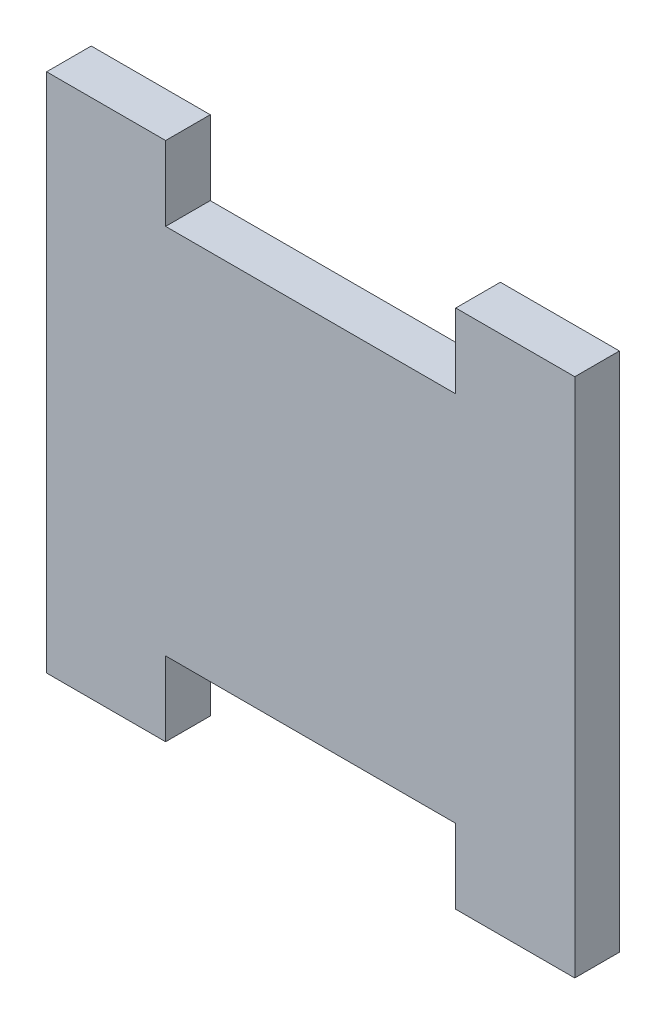
ISO-10303-21;
HEADER;
FILE_DESCRIPTION(('STEP AP214'),'2;1');
FILE_NAME('part.step','',(''),(''),'','','');
FILE_SCHEMA(('AUTOMOTIVE_DESIGN { 1 0 10303 214 1 1 1 1 }'));
ENDSEC;
DATA;
#1=APPLICATION_CONTEXT('core data for automotive mechanical design processes');
#2=APPLICATION_PROTOCOL_DEFINITION('international standard','automotive_design',2000,#1);
#3=PRODUCT_CONTEXT('',#1,'mechanical');
#4=PRODUCT('Part','Part','',(#3));
#5=PRODUCT_RELATED_PRODUCT_CATEGORY('part','',(#4));
#6=PRODUCT_DEFINITION_FORMATION('','',#4);
#7=PRODUCT_DEFINITION_CONTEXT('part definition',#1,'design');
#8=PRODUCT_DEFINITION('design','',#6,#7);
#9=PRODUCT_DEFINITION_SHAPE('','',#8);
#10=(LENGTH_UNIT() NAMED_UNIT(*) SI_UNIT(.MILLI.,.METRE.));
#11=(NAMED_UNIT(*) PLANE_ANGLE_UNIT() SI_UNIT($,.RADIAN.));
#12=(NAMED_UNIT(*) SI_UNIT($,.STERADIAN.) SOLID_ANGLE_UNIT());
#13=UNCERTAINTY_MEASURE_WITH_UNIT(LENGTH_MEASURE(1.E-05),#10,'distance_accuracy_value','');
#14=(GEOMETRIC_REPRESENTATION_CONTEXT(3) GLOBAL_UNCERTAINTY_ASSIGNED_CONTEXT((#13)) GLOBAL_UNIT_ASSIGNED_CONTEXT((#10,
#11,#12)) REPRESENTATION_CONTEXT('',''));
#15=CARTESIAN_POINT('',(0.,0.,0.));
#16=DIRECTION('',(0.,0.,1.));
#17=DIRECTION('',(1.,0.,0.));
#18=AXIS2_PLACEMENT_3D('',#15,#16,#17);
#19=CARTESIAN_POINT('',(-9.75000000000001,13.0041722799577,3.));
#20=DIRECTION('',(-1.,0.,0.));
#21=DIRECTION('',(0.,0.,1.));
#22=AXIS2_PLACEMENT_3D('',#19,#20,#21);
#23=PLANE('',#22);
#24=DIRECTION('',(0.,1.,0.));
#25=VECTOR('',#24,1.);
#26=CARTESIAN_POINT('',(-9.75000000000001,13.0041722799577,0.));
#27=LINE('',#26,#25);
#28=CARTESIAN_POINT('',(-9.75000000000001,13.0041722799577,0.));
#29=VERTEX_POINT('',#28);
#30=CARTESIAN_POINT('',(-9.75000000000001,18.0041722799577,0.));
#31=VERTEX_POINT('',#30);
#32=EDGE_CURVE('E153',#29,#31,#27,.T.);
#33=ORIENTED_EDGE('',*,*,#32,.T.);
#34=DIRECTION('',(0.,0.,-1.));
#35=VECTOR('',#34,1.);
#36=CARTESIAN_POINT('',(-9.75000000000001,18.0041722799577,3.));
#37=LINE('',#36,#35);
#38=CARTESIAN_POINT('',(-9.75000000000001,18.0041722799577,3.));
#39=VERTEX_POINT('',#38);
#40=EDGE_CURVE('E11',#39,#31,#37,.T.);
#41=ORIENTED_EDGE('',*,*,#40,.F.);
#42=DIRECTION('',(0.,1.,0.));
#43=VECTOR('',#42,1.);
#44=CARTESIAN_POINT('',(-9.75000000000001,13.0041722799577,3.));
#45=LINE('',#44,#43);
#46=CARTESIAN_POINT('',(-9.75000000000001,13.0041722799577,3.));
#47=VERTEX_POINT('',#46);
#48=EDGE_CURVE('E178',#47,#39,#45,.T.);
#49=ORIENTED_EDGE('',*,*,#48,.F.);
#50=DIRECTION('',(0.,0.,-1.));
#51=VECTOR('',#50,1.);
#52=CARTESIAN_POINT('',(-9.75000000000001,13.0041722799577,3.));
#53=LINE('',#52,#51);
#54=EDGE_CURVE('E149',#47,#29,#53,.T.);
#55=ORIENTED_EDGE('',*,*,#54,.T.);
#56=EDGE_LOOP('',(#33,#41,#49,#55));
#57=FACE_BOUND('',#56,.T.);
#58=ADVANCED_FACE('F33',(#57),#23,.F.);
#59=CARTESIAN_POINT('',(-9.75000000000001,18.0041722799577,3.));
#60=DIRECTION('',(0.,-1.,0.));
#61=DIRECTION('',(0.,0.,-1.));
#62=AXIS2_PLACEMENT_3D('',#59,#60,#61);
#63=PLANE('',#62);
#64=DIRECTION('',(-1.,0.,0.));
#65=VECTOR('',#64,1.);
#66=CARTESIAN_POINT('',(-9.75000000000001,18.0041722799577,0.));
#67=LINE('',#66,#65);
#68=CARTESIAN_POINT('',(-17.75,18.0041722799577,0.));
#69=VERTEX_POINT('',#68);
#70=EDGE_CURVE('E156',#31,#69,#67,.T.);
#71=ORIENTED_EDGE('',*,*,#70,.T.);
#72=DIRECTION('',(0.,0.,-1.));
#73=VECTOR('',#72,1.);
#74=CARTESIAN_POINT('',(-17.75,18.0041722799577,3.));
#75=LINE('',#74,#73);
#76=CARTESIAN_POINT('',(-17.75,18.0041722799577,3.));
#77=VERTEX_POINT('',#76);
#78=EDGE_CURVE('E41',#77,#69,#75,.T.);
#79=ORIENTED_EDGE('',*,*,#78,.F.);
#80=DIRECTION('',(-1.,0.,0.));
#81=VECTOR('',#80,1.);
#82=CARTESIAN_POINT('',(-9.75000000000001,18.0041722799577,3.));
#83=LINE('',#82,#81);
#84=EDGE_CURVE('E104',#39,#77,#83,.T.);
#85=ORIENTED_EDGE('',*,*,#84,.F.);
#86=ORIENTED_EDGE('',*,*,#40,.T.);
#87=EDGE_LOOP('',(#71,#79,#85,#86));
#88=FACE_BOUND('',#87,.T.);
#89=ADVANCED_FACE('F205',(#88),#63,.F.);
#90=CARTESIAN_POINT('',(-17.75,-16.9958277200423,3.));
#91=DIRECTION('',(1.,0.,0.));
#92=DIRECTION('',(0.,0.,-1.));
#93=AXIS2_PLACEMENT_3D('',#90,#91,#92);
#94=PLANE('',#93);
#95=DIRECTION('',(0.,-1.,0.));
#96=VECTOR('',#95,1.);
#97=CARTESIAN_POINT('',(-17.75,-16.9958277200423,0.));
#98=LINE('',#97,#96);
#99=CARTESIAN_POINT('',(-17.75,-16.9958277200423,0.));
#100=VERTEX_POINT('',#99);
#101=EDGE_CURVE('E159',#69,#100,#98,.T.);
#102=ORIENTED_EDGE('',*,*,#101,.T.);
#103=DIRECTION('',(0.,0.,-1.));
#104=VECTOR('',#103,1.);
#105=CARTESIAN_POINT('',(-17.75,-16.9958277200423,3.));
#106=LINE('',#105,#104);
#107=CARTESIAN_POINT('',(-17.75,-16.9958277200423,3.));
#108=VERTEX_POINT('',#107);
#109=EDGE_CURVE('E197',#108,#100,#106,.T.);
#110=ORIENTED_EDGE('',*,*,#109,.F.);
#111=DIRECTION('',(0.,-1.,0.));
#112=VECTOR('',#111,1.);
#113=CARTESIAN_POINT('',(-17.75,18.0041722799577,3.));
#114=LINE('',#113,#112);
#115=EDGE_CURVE('E204',#77,#108,#114,.T.);
#116=ORIENTED_EDGE('',*,*,#115,.F.);
#117=ORIENTED_EDGE('',*,*,#78,.T.);
#118=EDGE_LOOP('',(#102,#110,#116,#117));
#119=FACE_BOUND('',#118,.T.);
#120=ADVANCED_FACE('F202',(#119),#94,.F.);
#121=CARTESIAN_POINT('',(-9.75000000000001,-16.9958277200423,3.));
#122=DIRECTION('',(0.,1.,0.));
#123=DIRECTION('',(0.,0.,1.));
#124=AXIS2_PLACEMENT_3D('',#121,#122,#123);
#125=PLANE('',#124);
#126=DIRECTION('',(1.,0.,0.));
#127=VECTOR('',#126,1.);
#128=CARTESIAN_POINT('',(-9.75000000000001,-16.9958277200423,0.));
#129=LINE('',#128,#127);
#130=CARTESIAN_POINT('',(-9.75000000000001,-16.9958277200423,0.));
#131=VERTEX_POINT('',#130);
#132=EDGE_CURVE('E161',#100,#131,#129,.T.);
#133=ORIENTED_EDGE('',*,*,#132,.T.);
#134=DIRECTION('',(0.,0.,-1.));
#135=VECTOR('',#134,1.);
#136=CARTESIAN_POINT('',(-9.75000000000001,-16.9958277200423,3.));
#137=LINE('',#136,#135);
#138=CARTESIAN_POINT('',(-9.75000000000001,-16.9958277200423,3.));
#139=VERTEX_POINT('',#138);
#140=EDGE_CURVE('E194',#139,#131,#137,.T.);
#141=ORIENTED_EDGE('',*,*,#140,.F.);
#142=DIRECTION('',(1.,0.,0.));
#143=VECTOR('',#142,1.);
#144=CARTESIAN_POINT('',(-9.75000000000001,-16.9958277200423,3.));
#145=LINE('',#144,#143);
#146=EDGE_CURVE('E223',#108,#139,#145,.T.);
#147=ORIENTED_EDGE('',*,*,#146,.F.);
#148=ORIENTED_EDGE('',*,*,#109,.T.);
#149=EDGE_LOOP('',(#133,#141,#147,#148));
#150=FACE_BOUND('',#149,.T.);
#151=ADVANCED_FACE('F214',(#150),#125,.F.);
#152=CARTESIAN_POINT('',(-9.75000000000001,-11.9958277200423,3.));
#153=DIRECTION('',(-1.,0.,0.));
#154=DIRECTION('',(0.,0.,1.));
#155=AXIS2_PLACEMENT_3D('',#152,#153,#154);
#156=PLANE('',#155);
#157=DIRECTION('',(0.,1.,0.));
#158=VECTOR('',#157,1.);
#159=CARTESIAN_POINT('',(-9.75000000000001,-11.9958277200423,0.));
#160=LINE('',#159,#158);
#161=CARTESIAN_POINT('',(-9.75000000000001,-11.9958277200423,0.));
#162=VERTEX_POINT('',#161);
#163=EDGE_CURVE('E163',#131,#162,#160,.T.);
#164=ORIENTED_EDGE('',*,*,#163,.T.);
#165=DIRECTION('',(0.,0.,-1.));
#166=VECTOR('',#165,1.);
#167=CARTESIAN_POINT('',(-9.75000000000001,-11.9958277200423,3.));
#168=LINE('',#167,#166);
#169=CARTESIAN_POINT('',(-9.75000000000001,-11.9958277200423,3.));
#170=VERTEX_POINT('',#169);
#171=EDGE_CURVE('E191',#170,#162,#168,.T.);
#172=ORIENTED_EDGE('',*,*,#171,.F.);
#173=DIRECTION('',(0.,1.,0.));
#174=VECTOR('',#173,1.);
#175=CARTESIAN_POINT('',(-9.75000000000001,-11.9958277200423,3.));
#176=LINE('',#175,#174);
#177=EDGE_CURVE('E220',#139,#170,#176,.T.);
#178=ORIENTED_EDGE('',*,*,#177,.F.);
#179=ORIENTED_EDGE('',*,*,#140,.T.);
#180=EDGE_LOOP('',(#164,#172,#178,#179));
#181=FACE_BOUND('',#180,.T.);
#182=ADVANCED_FACE('F218',(#181),#156,.F.);
#183=CARTESIAN_POINT('',(9.75,-11.9958277200423,3.));
#184=DIRECTION('',(0.,1.,0.));
#185=DIRECTION('',(0.,0.,1.));
#186=AXIS2_PLACEMENT_3D('',#183,#184,#185);
#187=PLANE('',#186);
#188=DIRECTION('',(1.,0.,0.));
#189=VECTOR('',#188,1.);
#190=CARTESIAN_POINT('',(9.75,-11.9958277200423,0.));
#191=LINE('',#190,#189);
#192=CARTESIAN_POINT('',(9.75,-11.9958277200423,0.));
#193=VERTEX_POINT('',#192);
#194=EDGE_CURVE('E166',#162,#193,#191,.T.);
#195=ORIENTED_EDGE('',*,*,#194,.T.);
#196=DIRECTION('',(0.,0.,-1.));
#197=VECTOR('',#196,1.);
#198=CARTESIAN_POINT('',(9.75,-11.9958277200423,3.));
#199=LINE('',#198,#197);
#200=CARTESIAN_POINT('',(9.75,-11.9958277200423,3.));
#201=VERTEX_POINT('',#200);
#202=EDGE_CURVE('E188',#201,#193,#199,.T.);
#203=ORIENTED_EDGE('',*,*,#202,.F.);
#204=DIRECTION('',(1.,0.,0.));
#205=VECTOR('',#204,1.);
#206=CARTESIAN_POINT('',(0.,-11.9958277200423,3.));
#207=LINE('',#206,#205);
#208=EDGE_CURVE('E222',#170,#201,#207,.T.);
#209=ORIENTED_EDGE('',*,*,#208,.F.);
#210=ORIENTED_EDGE('',*,*,#171,.T.);
#211=EDGE_LOOP('',(#195,#203,#209,#210));
#212=FACE_BOUND('',#211,.T.);
#213=ADVANCED_FACE('F246',(#212),#187,.F.);
#214=CARTESIAN_POINT('',(9.75,-16.9958277200423,3.));
#215=DIRECTION('',(1.,0.,0.));
#216=DIRECTION('',(0.,0.,-1.));
#217=AXIS2_PLACEMENT_3D('',#214,#215,#216);
#218=PLANE('',#217);
#219=DIRECTION('',(0.,-1.,0.));
#220=VECTOR('',#219,1.);
#221=CARTESIAN_POINT('',(9.75,-16.9958277200423,0.));
#222=LINE('',#221,#220);
#223=CARTESIAN_POINT('',(9.75,-16.9958277200423,0.));
#224=VERTEX_POINT('',#223);
#225=EDGE_CURVE('E168',#193,#224,#222,.T.);
#226=ORIENTED_EDGE('',*,*,#225,.T.);
#227=DIRECTION('',(0.,0.,-1.));
#228=VECTOR('',#227,1.);
#229=CARTESIAN_POINT('',(9.75,-16.9958277200423,3.));
#230=LINE('',#229,#228);
#231=CARTESIAN_POINT('',(9.75,-16.9958277200423,3.));
#232=VERTEX_POINT('',#231);
#233=EDGE_CURVE('E185',#232,#224,#230,.T.);
#234=ORIENTED_EDGE('',*,*,#233,.F.);
#235=DIRECTION('',(0.,-1.,0.));
#236=VECTOR('',#235,1.);
#237=CARTESIAN_POINT('',(9.75,-16.9958277200423,3.));
#238=LINE('',#237,#236);
#239=EDGE_CURVE('E225',#201,#232,#238,.T.);
#240=ORIENTED_EDGE('',*,*,#239,.F.);
#241=ORIENTED_EDGE('',*,*,#202,.T.);
#242=EDGE_LOOP('',(#226,#234,#240,#241));
#243=FACE_BOUND('',#242,.T.);
#244=ADVANCED_FACE('F243',(#243),#218,.F.);
#245=CARTESIAN_POINT('',(17.75,-16.9958277200423,3.));
#246=DIRECTION('',(0.,1.,0.));
#247=DIRECTION('',(0.,0.,1.));
#248=AXIS2_PLACEMENT_3D('',#245,#246,#247);
#249=PLANE('',#248);
#250=DIRECTION('',(1.,0.,0.));
#251=VECTOR('',#250,1.);
#252=CARTESIAN_POINT('',(17.75,-16.9958277200423,0.));
#253=LINE('',#252,#251);
#254=CARTESIAN_POINT('',(17.75,-16.9958277200423,0.));
#255=VERTEX_POINT('',#254);
#256=EDGE_CURVE('E170',#224,#255,#253,.T.);
#257=ORIENTED_EDGE('',*,*,#256,.T.);
#258=DIRECTION('',(0.,0.,-1.));
#259=VECTOR('',#258,1.);
#260=CARTESIAN_POINT('',(17.75,-16.9958277200423,3.));
#261=LINE('',#260,#259);
#262=CARTESIAN_POINT('',(17.75,-16.9958277200423,3.));
#263=VERTEX_POINT('',#262);
#264=EDGE_CURVE('E182',#263,#255,#261,.T.);
#265=ORIENTED_EDGE('',*,*,#264,.F.);
#266=DIRECTION('',(1.,0.,0.));
#267=VECTOR('',#266,1.);
#268=CARTESIAN_POINT('',(17.75,-16.9958277200423,3.));
#269=LINE('',#268,#267);
#270=EDGE_CURVE('E231',#232,#263,#269,.T.);
#271=ORIENTED_EDGE('',*,*,#270,.F.);
#272=ORIENTED_EDGE('',*,*,#233,.T.);
#273=EDGE_LOOP('',(#257,#265,#271,#272));
#274=FACE_BOUND('',#273,.T.);
#275=ADVANCED_FACE('F237',(#274),#249,.F.);
#276=CARTESIAN_POINT('',(17.75,18.0041722799577,3.));
#277=DIRECTION('',(-1.,0.,0.));
#278=DIRECTION('',(0.,0.,1.));
#279=AXIS2_PLACEMENT_3D('',#276,#277,#278);
#280=PLANE('',#279);
#281=DIRECTION('',(0.,1.,0.));
#282=VECTOR('',#281,1.);
#283=CARTESIAN_POINT('',(17.75,18.0041722799577,0.));
#284=LINE('',#283,#282);
#285=CARTESIAN_POINT('',(17.75,18.0041722799577,0.));
#286=VERTEX_POINT('',#285);
#287=EDGE_CURVE('E173',#255,#286,#284,.T.);
#288=ORIENTED_EDGE('',*,*,#287,.T.);
#289=DIRECTION('',(0.,0.,-1.));
#290=VECTOR('',#289,1.);
#291=CARTESIAN_POINT('',(17.75,18.0041722799577,3.));
#292=LINE('',#291,#290);
#293=CARTESIAN_POINT('',(17.75,18.0041722799577,3.));
#294=VERTEX_POINT('',#293);
#295=EDGE_CURVE('E144',#294,#286,#292,.T.);
#296=ORIENTED_EDGE('',*,*,#295,.F.);
#297=DIRECTION('',(0.,1.,0.));
#298=VECTOR('',#297,1.);
#299=CARTESIAN_POINT('',(17.75,13.0041722799577,3.));
#300=LINE('',#299,#298);
#301=EDGE_CURVE('E135',#263,#294,#300,.T.);
#302=ORIENTED_EDGE('',*,*,#301,.F.);
#303=ORIENTED_EDGE('',*,*,#264,.T.);
#304=EDGE_LOOP('',(#288,#296,#302,#303));
#305=FACE_BOUND('',#304,.T.);
#306=ADVANCED_FACE('F240',(#305),#280,.F.);
#307=CARTESIAN_POINT('',(9.74999999999999,18.0041722799577,3.));
#308=DIRECTION('',(0.,-1.,0.));
#309=DIRECTION('',(0.,0.,-1.));
#310=AXIS2_PLACEMENT_3D('',#307,#308,#309);
#311=PLANE('',#310);
#312=DIRECTION('',(-1.,0.,0.));
#313=VECTOR('',#312,1.);
#314=CARTESIAN_POINT('',(9.74999999999999,18.0041722799577,0.));
#315=LINE('',#314,#313);
#316=CARTESIAN_POINT('',(9.74999999999999,18.0041722799577,0.));
#317=VERTEX_POINT('',#316);
#318=EDGE_CURVE('E143',#286,#317,#315,.T.);
#319=ORIENTED_EDGE('',*,*,#318,.T.);
#320=DIRECTION('',(0.,0.,-1.));
#321=VECTOR('',#320,1.);
#322=CARTESIAN_POINT('',(9.74999999999999,18.0041722799577,3.));
#323=LINE('',#322,#321);
#324=CARTESIAN_POINT('',(9.74999999999999,18.0041722799577,3.));
#325=VERTEX_POINT('',#324);
#326=EDGE_CURVE('E140',#325,#317,#323,.T.);
#327=ORIENTED_EDGE('',*,*,#326,.F.);
#328=DIRECTION('',(-1.,0.,0.));
#329=VECTOR('',#328,1.);
#330=CARTESIAN_POINT('',(9.74999999999999,18.0041722799577,3.));
#331=LINE('',#330,#329);
#332=EDGE_CURVE('E129',#294,#325,#331,.T.);
#333=ORIENTED_EDGE('',*,*,#332,.F.);
#334=ORIENTED_EDGE('',*,*,#295,.T.);
#335=EDGE_LOOP('',(#319,#327,#333,#334));
#336=FACE_BOUND('',#335,.T.);
#337=ADVANCED_FACE('F141',(#336),#311,.F.);
#338=CARTESIAN_POINT('',(9.74999999999999,13.0041722799577,3.));
#339=DIRECTION('',(1.,0.,0.));
#340=DIRECTION('',(0.,0.,-1.));
#341=AXIS2_PLACEMENT_3D('',#338,#339,#340);
#342=PLANE('',#341);
#343=DIRECTION('',(0.,-1.,0.));
#344=VECTOR('',#343,1.);
#345=CARTESIAN_POINT('',(9.74999999999999,13.0041722799577,0.));
#346=LINE('',#345,#344);
#347=CARTESIAN_POINT('',(9.74999999999999,13.0041722799577,0.));
#348=VERTEX_POINT('',#347);
#349=EDGE_CURVE('E90',#317,#348,#346,.T.);
#350=ORIENTED_EDGE('',*,*,#349,.T.);
#351=DIRECTION('',(0.,0.,-1.));
#352=VECTOR('',#351,1.);
#353=CARTESIAN_POINT('',(9.74999999999999,13.0041722799577,3.));
#354=LINE('',#353,#352);
#355=CARTESIAN_POINT('',(9.74999999999999,13.0041722799577,3.));
#356=VERTEX_POINT('',#355);
#357=EDGE_CURVE('E145',#356,#348,#354,.T.);
#358=ORIENTED_EDGE('',*,*,#357,.F.);
#359=DIRECTION('',(0.,-1.,0.));
#360=VECTOR('',#359,1.);
#361=CARTESIAN_POINT('',(9.74999999999999,13.0041722799577,3.));
#362=LINE('',#361,#360);
#363=EDGE_CURVE('E133',#325,#356,#362,.T.);
#364=ORIENTED_EDGE('',*,*,#363,.F.);
#365=ORIENTED_EDGE('',*,*,#326,.T.);
#366=EDGE_LOOP('',(#350,#358,#364,#365));
#367=FACE_BOUND('',#366,.T.);
#368=ADVANCED_FACE('F147',(#367),#342,.F.);
#369=CARTESIAN_POINT('',(-9.75000000000001,13.0041722799577,3.));
#370=DIRECTION('',(0.,-1.,0.));
#371=DIRECTION('',(0.,0.,-1.));
#372=AXIS2_PLACEMENT_3D('',#369,#370,#371);
#373=PLANE('',#372);
#374=DIRECTION('',(-1.,0.,0.));
#375=VECTOR('',#374,1.);
#376=CARTESIAN_POINT('',(-9.75000000000001,13.0041722799577,0.));
#377=LINE('',#376,#375);
#378=EDGE_CURVE('E96',#348,#29,#377,.T.);
#379=ORIENTED_EDGE('',*,*,#378,.T.);
#380=ORIENTED_EDGE('',*,*,#54,.F.);
#381=DIRECTION('',(-1.,0.,0.));
#382=VECTOR('',#381,1.);
#383=CARTESIAN_POINT('',(-9.75000000000001,13.0041722799577,3.));
#384=LINE('',#383,#382);
#385=EDGE_CURVE('E49',#356,#47,#384,.T.);
#386=ORIENTED_EDGE('',*,*,#385,.F.);
#387=ORIENTED_EDGE('',*,*,#357,.T.);
#388=EDGE_LOOP('',(#379,#380,#386,#387));
#389=FACE_BOUND('',#388,.T.);
#390=ADVANCED_FACE('F261',(#389),#373,.F.);
#391=CARTESIAN_POINT('',(0.,0.,3.));
#392=DIRECTION('',(0.,0.,1.));
#393=DIRECTION('',(1.,0.,0.));
#394=AXIS2_PLACEMENT_3D('',#391,#392,#393);
#395=PLANE('',#394);
#396=ORIENTED_EDGE('',*,*,#48,.T.);
#397=ORIENTED_EDGE('',*,*,#84,.T.);
#398=ORIENTED_EDGE('',*,*,#115,.T.);
#399=ORIENTED_EDGE('',*,*,#146,.T.);
#400=ORIENTED_EDGE('',*,*,#177,.T.);
#401=ORIENTED_EDGE('',*,*,#208,.T.);
#402=ORIENTED_EDGE('',*,*,#239,.T.);
#403=ORIENTED_EDGE('',*,*,#270,.T.);
#404=ORIENTED_EDGE('',*,*,#301,.T.);
#405=ORIENTED_EDGE('',*,*,#332,.T.);
#406=ORIENTED_EDGE('',*,*,#363,.T.);
#407=ORIENTED_EDGE('',*,*,#385,.T.);
#408=EDGE_LOOP('',(#396,#397,#398,#399,#400,#401,#402,#403,#404,#405,#406,#407));
#409=FACE_BOUND('',#408,.T.);
#410=ADVANCED_FACE('F131',(#409),#395,.T.);
#411=CARTESIAN_POINT('',(0.,0.,0.));
#412=DIRECTION('',(0.,0.,1.));
#413=DIRECTION('',(1.,0.,0.));
#414=AXIS2_PLACEMENT_3D('',#411,#412,#413);
#415=PLANE('',#414);
#416=ORIENTED_EDGE('',*,*,#32,.F.);
#417=ORIENTED_EDGE('',*,*,#378,.F.);
#418=ORIENTED_EDGE('',*,*,#349,.F.);
#419=ORIENTED_EDGE('',*,*,#318,.F.);
#420=ORIENTED_EDGE('',*,*,#287,.F.);
#421=ORIENTED_EDGE('',*,*,#256,.F.);
#422=ORIENTED_EDGE('',*,*,#225,.F.);
#423=ORIENTED_EDGE('',*,*,#194,.F.);
#424=ORIENTED_EDGE('',*,*,#163,.F.);
#425=ORIENTED_EDGE('',*,*,#132,.F.);
#426=ORIENTED_EDGE('',*,*,#101,.F.);
#427=ORIENTED_EDGE('',*,*,#70,.F.);
#428=EDGE_LOOP('',(#416,#417,#418,#419,#420,#421,#422,#423,#424,#425,#426,#427));
#429=FACE_BOUND('',#428,.T.);
#430=ADVANCED_FACE('F209',(#429),#415,.F.);
#431=CLOSED_SHELL('',(#58,#89,#120,#151,#182,#213,#244,#275,#306,#337,#368,#390,#410,#430));
#432=MANIFOLD_SOLID_BREP('B2',#431);
#433=ADVANCED_BREP_SHAPE_REPRESENTATION('',(#18,#432),#14);
#434=SHAPE_DEFINITION_REPRESENTATION(#9,#433);
ENDSEC;
END-ISO-10303-21;
